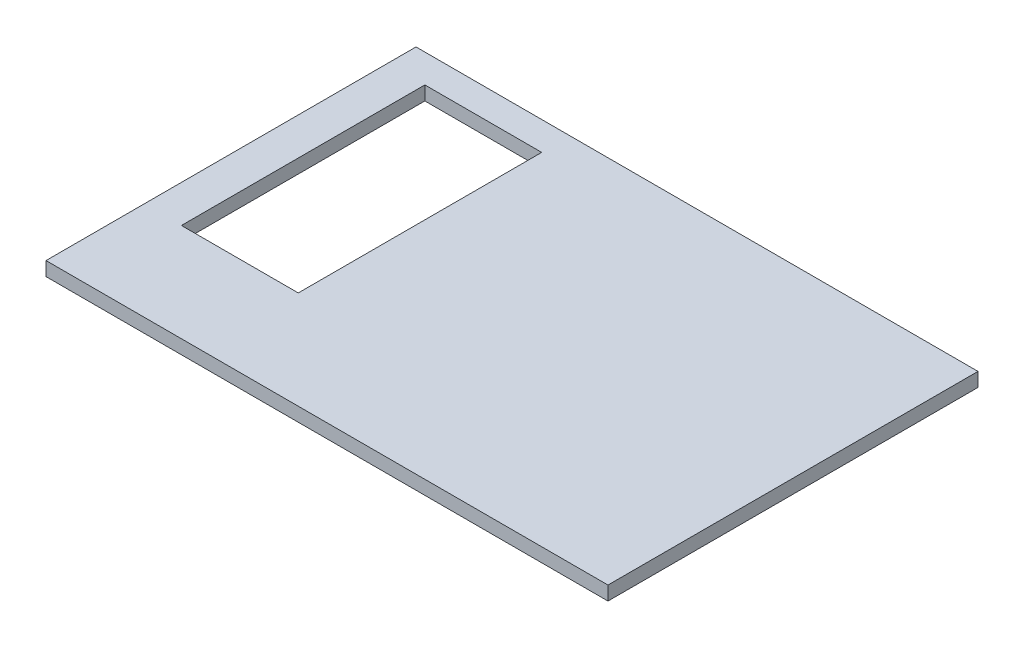
ISO-10303-21;
HEADER;
FILE_DESCRIPTION(('STEP AP214'),'2;1');
FILE_NAME('part.step','',(''),(''),'','','');
FILE_SCHEMA(('AUTOMOTIVE_DESIGN { 1 0 10303 214 1 1 1 1 }'));
ENDSEC;
DATA;
#1=APPLICATION_CONTEXT('core data for automotive mechanical design processes');
#2=APPLICATION_PROTOCOL_DEFINITION('international standard','automotive_design',2000,#1);
#3=PRODUCT_CONTEXT('',#1,'mechanical');
#4=PRODUCT('Part','Part','',(#3));
#5=PRODUCT_RELATED_PRODUCT_CATEGORY('part','',(#4));
#6=PRODUCT_DEFINITION_FORMATION('','',#4);
#7=PRODUCT_DEFINITION_CONTEXT('part definition',#1,'design');
#8=PRODUCT_DEFINITION('design','',#6,#7);
#9=PRODUCT_DEFINITION_SHAPE('','',#8);
#10=(LENGTH_UNIT() NAMED_UNIT(*) SI_UNIT(.MILLI.,.METRE.));
#11=(NAMED_UNIT(*) PLANE_ANGLE_UNIT() SI_UNIT($,.RADIAN.));
#12=(NAMED_UNIT(*) SI_UNIT($,.STERADIAN.) SOLID_ANGLE_UNIT());
#13=UNCERTAINTY_MEASURE_WITH_UNIT(LENGTH_MEASURE(1.E-05),#10,'distance_accuracy_value','');
#14=(GEOMETRIC_REPRESENTATION_CONTEXT(3) GLOBAL_UNCERTAINTY_ASSIGNED_CONTEXT((#13)) GLOBAL_UNIT_ASSIGNED_CONTEXT((#10,
#11,#12)) REPRESENTATION_CONTEXT('',''));
#15=CARTESIAN_POINT('',(0.,0.,0.));
#16=DIRECTION('',(0.,0.,1.));
#17=DIRECTION('',(1.,0.,0.));
#18=AXIS2_PLACEMENT_3D('',#15,#16,#17);
#19=CARTESIAN_POINT('',(0.,5.,0.));
#20=DIRECTION('',(0.,-1.,0.));
#21=DIRECTION('',(0.,0.,-1.));
#22=AXIS2_PLACEMENT_3D('',#19,#20,#21);
#23=PLANE('',#22);
#24=DIRECTION('',(0.,0.,1.));
#25=VECTOR('',#24,1.);
#26=CARTESIAN_POINT('',(0.,5.,0.));
#27=LINE('',#26,#25);
#28=CARTESIAN_POINT('',(0.,5.,-133.));
#29=VERTEX_POINT('',#28);
#30=CARTESIAN_POINT('',(0.,5.,0.));
#31=VERTEX_POINT('',#30);
#32=EDGE_CURVE('E132',#29,#31,#27,.T.);
#33=ORIENTED_EDGE('',*,*,#32,.T.);
#34=DIRECTION('',(1.,0.,0.));
#35=VECTOR('',#34,1.);
#36=CARTESIAN_POINT('',(0.,5.,0.));
#37=LINE('',#36,#35);
#38=CARTESIAN_POINT('',(202.,5.,0.));
#39=VERTEX_POINT('',#38);
#40=EDGE_CURVE('E135',#31,#39,#37,.T.);
#41=ORIENTED_EDGE('',*,*,#40,.T.);
#42=DIRECTION('',(0.,0.,-1.));
#43=VECTOR('',#42,1.);
#44=CARTESIAN_POINT('',(202.,5.,0.));
#45=LINE('',#44,#43);
#46=CARTESIAN_POINT('',(202.,5.,-133.));
#47=VERTEX_POINT('',#46);
#48=EDGE_CURVE('E138',#39,#47,#45,.T.);
#49=ORIENTED_EDGE('',*,*,#48,.T.);
#50=DIRECTION('',(-1.,0.,0.));
#51=VECTOR('',#50,1.);
#52=CARTESIAN_POINT('',(0.,5.,-133.));
#53=LINE('',#52,#51);
#54=EDGE_CURVE('E140',#47,#29,#53,.T.);
#55=ORIENTED_EDGE('',*,*,#54,.T.);
#56=EDGE_LOOP('',(#33,#41,#49,#55));
#57=FACE_BOUND('',#56,.T.);
#58=DIRECTION('',(0.,0.,1.));
#59=VECTOR('',#58,1.);
#60=CARTESIAN_POINT('',(13.4170787764409,5.,-122.759995329313));
#61=LINE('',#60,#59);
#62=CARTESIAN_POINT('',(13.4170787764409,5.,-122.759995329313));
#63=VERTEX_POINT('',#62);
#64=CARTESIAN_POINT('',(13.4170787764409,5.,-35.2599971651915));
#65=VERTEX_POINT('',#64);
#66=EDGE_CURVE('E96',#63,#65,#61,.T.);
#67=ORIENTED_EDGE('',*,*,#66,.F.);
#68=DIRECTION('',(-1.,0.,0.));
#69=VECTOR('',#68,1.);
#70=CARTESIAN_POINT('',(13.4170787764409,5.,-122.759995329313));
#71=LINE('',#70,#69);
#72=CARTESIAN_POINT('',(55.4170826011873,5.,-122.759995329313));
#73=VERTEX_POINT('',#72);
#74=EDGE_CURVE('E118',#73,#63,#71,.T.);
#75=ORIENTED_EDGE('',*,*,#74,.F.);
#76=DIRECTION('',(0.,0.,-1.));
#77=VECTOR('',#76,1.);
#78=CARTESIAN_POINT('',(55.4170826011873,5.,-122.759995329313));
#79=LINE('',#78,#77);
#80=CARTESIAN_POINT('',(55.4170826011873,5.,-35.2599971651915));
#81=VERTEX_POINT('',#80);
#82=EDGE_CURVE('E116',#81,#73,#79,.T.);
#83=ORIENTED_EDGE('',*,*,#82,.F.);
#84=DIRECTION('',(1.,0.,0.));
#85=VECTOR('',#84,1.);
#86=CARTESIAN_POINT('',(13.4170787764409,5.,-35.2599971651915));
#87=LINE('',#86,#85);
#88=EDGE_CURVE('E104',#65,#81,#87,.T.);
#89=ORIENTED_EDGE('',*,*,#88,.F.);
#90=EDGE_LOOP('',(#67,#75,#83,#89));
#91=FACE_BOUND('',#90,.T.);
#92=ADVANCED_FACE('F31',(#57,#91),#23,.F.);
#93=CARTESIAN_POINT('',(0.,0.,0.));
#94=DIRECTION('',(0.,-1.,0.));
#95=DIRECTION('',(0.,0.,-1.));
#96=AXIS2_PLACEMENT_3D('',#93,#94,#95);
#97=PLANE('',#96);
#98=DIRECTION('',(0.,0.,1.));
#99=VECTOR('',#98,1.);
#100=CARTESIAN_POINT('',(0.,0.,0.));
#101=LINE('',#100,#99);
#102=CARTESIAN_POINT('',(0.,0.,-133.));
#103=VERTEX_POINT('',#102);
#104=CARTESIAN_POINT('',(0.,0.,0.));
#105=VERTEX_POINT('',#104);
#106=EDGE_CURVE('E112',#103,#105,#101,.T.);
#107=ORIENTED_EDGE('',*,*,#106,.F.);
#108=DIRECTION('',(-1.,0.,0.));
#109=VECTOR('',#108,1.);
#110=CARTESIAN_POINT('',(0.,0.,-133.));
#111=LINE('',#110,#109);
#112=CARTESIAN_POINT('',(202.,0.,-133.));
#113=VERTEX_POINT('',#112);
#114=EDGE_CURVE('E136',#113,#103,#111,.T.);
#115=ORIENTED_EDGE('',*,*,#114,.F.);
#116=DIRECTION('',(0.,0.,-1.));
#117=VECTOR('',#116,1.);
#118=CARTESIAN_POINT('',(202.,0.,0.));
#119=LINE('',#118,#117);
#120=CARTESIAN_POINT('',(202.,0.,0.));
#121=VERTEX_POINT('',#120);
#122=EDGE_CURVE('E147',#121,#113,#119,.T.);
#123=ORIENTED_EDGE('',*,*,#122,.F.);
#124=DIRECTION('',(1.,0.,0.));
#125=VECTOR('',#124,1.);
#126=CARTESIAN_POINT('',(0.,0.,0.));
#127=LINE('',#126,#125);
#128=EDGE_CURVE('E145',#105,#121,#127,.T.);
#129=ORIENTED_EDGE('',*,*,#128,.F.);
#130=EDGE_LOOP('',(#107,#115,#123,#129));
#131=FACE_BOUND('',#130,.T.);
#132=DIRECTION('',(-1.,0.,0.));
#133=VECTOR('',#132,1.);
#134=CARTESIAN_POINT('',(13.4170787764409,0.,-122.759995329313));
#135=LINE('',#134,#133);
#136=CARTESIAN_POINT('',(55.4170826011873,0.,-122.759995329313));
#137=VERTEX_POINT('',#136);
#138=CARTESIAN_POINT('',(13.4170787764409,0.,-122.759995329313));
#139=VERTEX_POINT('',#138);
#140=EDGE_CURVE('E105',#137,#139,#135,.T.);
#141=ORIENTED_EDGE('',*,*,#140,.T.);
#142=DIRECTION('',(0.,0.,1.));
#143=VECTOR('',#142,1.);
#144=CARTESIAN_POINT('',(13.4170787764409,0.,-122.759995329313));
#145=LINE('',#144,#143);
#146=CARTESIAN_POINT('',(13.4170787764409,0.,-35.2599971651915));
#147=VERTEX_POINT('',#146);
#148=EDGE_CURVE('E54',#139,#147,#145,.T.);
#149=ORIENTED_EDGE('',*,*,#148,.T.);
#150=DIRECTION('',(1.,0.,0.));
#151=VECTOR('',#150,1.);
#152=CARTESIAN_POINT('',(13.4170787764409,0.,-35.2599971651915));
#153=LINE('',#152,#151);
#154=CARTESIAN_POINT('',(55.4170826011873,0.,-35.2599971651915));
#155=VERTEX_POINT('',#154);
#156=EDGE_CURVE('E111',#147,#155,#153,.T.);
#157=ORIENTED_EDGE('',*,*,#156,.T.);
#158=DIRECTION('',(0.,0.,-1.));
#159=VECTOR('',#158,1.);
#160=CARTESIAN_POINT('',(55.4170826011873,0.,-122.759995329313));
#161=LINE('',#160,#159);
#162=EDGE_CURVE('E124',#155,#137,#161,.T.);
#163=ORIENTED_EDGE('',*,*,#162,.T.);
#164=EDGE_LOOP('',(#141,#149,#157,#163));
#165=FACE_BOUND('',#164,.T.);
#166=ADVANCED_FACE('F165',(#131,#165),#97,.T.);
#167=CARTESIAN_POINT('',(0.,5.,0.));
#168=DIRECTION('',(1.,0.,0.));
#169=DIRECTION('',(0.,0.,-1.));
#170=AXIS2_PLACEMENT_3D('',#167,#168,#169);
#171=PLANE('',#170);
#172=ORIENTED_EDGE('',*,*,#106,.T.);
#173=DIRECTION('',(0.,-1.,0.));
#174=VECTOR('',#173,1.);
#175=CARTESIAN_POINT('',(0.,5.,0.));
#176=LINE('',#175,#174);
#177=EDGE_CURVE('E11',#31,#105,#176,.T.);
#178=ORIENTED_EDGE('',*,*,#177,.F.);
#179=ORIENTED_EDGE('',*,*,#32,.F.);
#180=DIRECTION('',(0.,-1.,0.));
#181=VECTOR('',#180,1.);
#182=CARTESIAN_POINT('',(0.,5.,-133.));
#183=LINE('',#182,#181);
#184=EDGE_CURVE('E142',#29,#103,#183,.T.);
#185=ORIENTED_EDGE('',*,*,#184,.T.);
#186=EDGE_LOOP('',(#172,#178,#179,#185));
#187=FACE_BOUND('',#186,.T.);
#188=ADVANCED_FACE('F33',(#187),#171,.F.);
#189=CARTESIAN_POINT('',(0.,5.,0.));
#190=DIRECTION('',(0.,0.,-1.));
#191=DIRECTION('',(-1.,0.,0.));
#192=AXIS2_PLACEMENT_3D('',#189,#190,#191);
#193=PLANE('',#192);
#194=ORIENTED_EDGE('',*,*,#128,.T.);
#195=DIRECTION('',(0.,-1.,0.));
#196=VECTOR('',#195,1.);
#197=CARTESIAN_POINT('',(202.,5.,0.));
#198=LINE('',#197,#196);
#199=EDGE_CURVE('E39',#39,#121,#198,.T.);
#200=ORIENTED_EDGE('',*,*,#199,.F.);
#201=ORIENTED_EDGE('',*,*,#40,.F.);
#202=ORIENTED_EDGE('',*,*,#177,.T.);
#203=EDGE_LOOP('',(#194,#200,#201,#202));
#204=FACE_BOUND('',#203,.T.);
#205=ADVANCED_FACE('F175',(#204),#193,.F.);
#206=CARTESIAN_POINT('',(202.,5.,0.));
#207=DIRECTION('',(-1.,0.,0.));
#208=DIRECTION('',(0.,0.,1.));
#209=AXIS2_PLACEMENT_3D('',#206,#207,#208);
#210=PLANE('',#209);
#211=ORIENTED_EDGE('',*,*,#122,.T.);
#212=DIRECTION('',(0.,-1.,0.));
#213=VECTOR('',#212,1.);
#214=CARTESIAN_POINT('',(202.,5.,-133.));
#215=LINE('',#214,#213);
#216=EDGE_CURVE('E152',#47,#113,#215,.T.);
#217=ORIENTED_EDGE('',*,*,#216,.F.);
#218=ORIENTED_EDGE('',*,*,#48,.F.);
#219=ORIENTED_EDGE('',*,*,#199,.T.);
#220=EDGE_LOOP('',(#211,#217,#218,#219));
#221=FACE_BOUND('',#220,.T.);
#222=ADVANCED_FACE('F159',(#221),#210,.F.);
#223=CARTESIAN_POINT('',(0.,5.,-133.));
#224=DIRECTION('',(0.,0.,1.));
#225=DIRECTION('',(1.,0.,0.));
#226=AXIS2_PLACEMENT_3D('',#223,#224,#225);
#227=PLANE('',#226);
#228=ORIENTED_EDGE('',*,*,#114,.T.);
#229=ORIENTED_EDGE('',*,*,#184,.F.);
#230=ORIENTED_EDGE('',*,*,#54,.F.);
#231=ORIENTED_EDGE('',*,*,#216,.T.);
#232=EDGE_LOOP('',(#228,#229,#230,#231));
#233=FACE_BOUND('',#232,.T.);
#234=ADVANCED_FACE('F169',(#233),#227,.F.);
#235=CARTESIAN_POINT('',(13.4170787764409,5.,-122.759995329313));
#236=DIRECTION('',(1.,0.,0.));
#237=DIRECTION('',(0.,0.,-1.));
#238=AXIS2_PLACEMENT_3D('',#235,#236,#237);
#239=PLANE('',#238);
#240=ORIENTED_EDGE('',*,*,#148,.F.);
#241=DIRECTION('',(0.,-1.,0.));
#242=VECTOR('',#241,1.);
#243=CARTESIAN_POINT('',(13.4170787764409,5.,-122.759995329313));
#244=LINE('',#243,#242);
#245=EDGE_CURVE('E100',#63,#139,#244,.T.);
#246=ORIENTED_EDGE('',*,*,#245,.F.);
#247=ORIENTED_EDGE('',*,*,#66,.T.);
#248=DIRECTION('',(0.,-1.,0.));
#249=VECTOR('',#248,1.);
#250=CARTESIAN_POINT('',(13.4170787764409,5.,-35.2599971651915));
#251=LINE('',#250,#249);
#252=EDGE_CURVE('E99',#65,#147,#251,.T.);
#253=ORIENTED_EDGE('',*,*,#252,.T.);
#254=EDGE_LOOP('',(#240,#246,#247,#253));
#255=FACE_BOUND('',#254,.T.);
#256=ADVANCED_FACE('F98',(#255),#239,.T.);
#257=CARTESIAN_POINT('',(13.4170787764409,5.,-35.2599971651915));
#258=DIRECTION('',(0.,0.,-1.));
#259=DIRECTION('',(-1.,0.,0.));
#260=AXIS2_PLACEMENT_3D('',#257,#258,#259);
#261=PLANE('',#260);
#262=ORIENTED_EDGE('',*,*,#156,.F.);
#263=ORIENTED_EDGE('',*,*,#252,.F.);
#264=ORIENTED_EDGE('',*,*,#88,.T.);
#265=DIRECTION('',(0.,-1.,0.));
#266=VECTOR('',#265,1.);
#267=CARTESIAN_POINT('',(55.4170826011873,5.,-35.2599971651915));
#268=LINE('',#267,#266);
#269=EDGE_CURVE('E113',#81,#155,#268,.T.);
#270=ORIENTED_EDGE('',*,*,#269,.T.);
#271=EDGE_LOOP('',(#262,#263,#264,#270));
#272=FACE_BOUND('',#271,.T.);
#273=ADVANCED_FACE('F108',(#272),#261,.T.);
#274=CARTESIAN_POINT('',(55.4170826011873,5.,-122.759995329313));
#275=DIRECTION('',(-1.,0.,0.));
#276=DIRECTION('',(0.,0.,1.));
#277=AXIS2_PLACEMENT_3D('',#274,#275,#276);
#278=PLANE('',#277);
#279=ORIENTED_EDGE('',*,*,#162,.F.);
#280=ORIENTED_EDGE('',*,*,#269,.F.);
#281=ORIENTED_EDGE('',*,*,#82,.T.);
#282=DIRECTION('',(0.,-1.,0.));
#283=VECTOR('',#282,1.);
#284=CARTESIAN_POINT('',(55.4170826011873,5.,-122.759995329313));
#285=LINE('',#284,#283);
#286=EDGE_CURVE('E46',#73,#137,#285,.T.);
#287=ORIENTED_EDGE('',*,*,#286,.T.);
#288=EDGE_LOOP('',(#279,#280,#281,#287));
#289=FACE_BOUND('',#288,.T.);
#290=ADVANCED_FACE('F198',(#289),#278,.T.);
#291=CARTESIAN_POINT('',(13.4170787764409,5.,-122.759995329313));
#292=DIRECTION('',(0.,0.,1.));
#293=DIRECTION('',(1.,0.,0.));
#294=AXIS2_PLACEMENT_3D('',#291,#292,#293);
#295=PLANE('',#294);
#296=ORIENTED_EDGE('',*,*,#140,.F.);
#297=ORIENTED_EDGE('',*,*,#286,.F.);
#298=ORIENTED_EDGE('',*,*,#74,.T.);
#299=ORIENTED_EDGE('',*,*,#245,.T.);
#300=EDGE_LOOP('',(#296,#297,#298,#299));
#301=FACE_BOUND('',#300,.T.);
#302=ADVANCED_FACE('F202',(#301),#295,.T.);
#303=CLOSED_SHELL('',(#92,#166,#188,#205,#222,#234,#256,#273,#290,#302));
#304=MANIFOLD_SOLID_BREP('B2',#303);
#305=ADVANCED_BREP_SHAPE_REPRESENTATION('',(#18,#304),#14);
#306=SHAPE_DEFINITION_REPRESENTATION(#9,#305);
ENDSEC;
END-ISO-10303-21;
